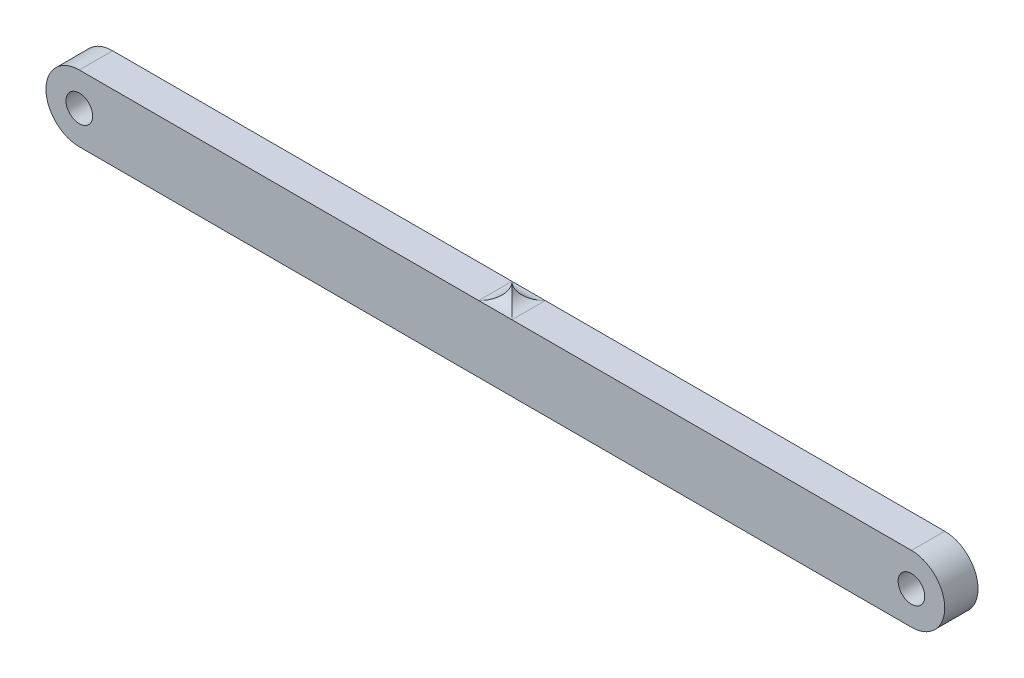
ISO-10303-21;
HEADER;
FILE_DESCRIPTION(('STEP AP214'),'2;1');
FILE_NAME('part.step','',(''),(''),'','','');
FILE_SCHEMA(('AUTOMOTIVE_DESIGN { 1 0 10303 214 1 1 1 1 }'));
ENDSEC;
DATA;
#1=APPLICATION_CONTEXT('core data for automotive mechanical design processes');
#2=APPLICATION_PROTOCOL_DEFINITION('international standard','automotive_design',2000,#1);
#3=PRODUCT_CONTEXT('',#1,'mechanical');
#4=PRODUCT('Part','Part','',(#3));
#5=PRODUCT_RELATED_PRODUCT_CATEGORY('part','',(#4));
#6=PRODUCT_DEFINITION_FORMATION('','',#4);
#7=PRODUCT_DEFINITION_CONTEXT('part definition',#1,'design');
#8=PRODUCT_DEFINITION('design','',#6,#7);
#9=PRODUCT_DEFINITION_SHAPE('','',#8);
#10=(LENGTH_UNIT() NAMED_UNIT(*) SI_UNIT(.MILLI.,.METRE.));
#11=(NAMED_UNIT(*) PLANE_ANGLE_UNIT() SI_UNIT($,.RADIAN.));
#12=(NAMED_UNIT(*) SI_UNIT($,.STERADIAN.) SOLID_ANGLE_UNIT());
#13=UNCERTAINTY_MEASURE_WITH_UNIT(LENGTH_MEASURE(1.E-05),#10,'distance_accuracy_value','');
#14=(GEOMETRIC_REPRESENTATION_CONTEXT(3) GLOBAL_UNCERTAINTY_ASSIGNED_CONTEXT((#13)) GLOBAL_UNIT_ASSIGNED_CONTEXT((#10,
#11,#12)) REPRESENTATION_CONTEXT('',''));
#15=CARTESIAN_POINT('',(0.,0.,0.));
#16=DIRECTION('',(0.,0.,1.));
#17=DIRECTION('',(1.,0.,0.));
#18=AXIS2_PLACEMENT_3D('',#15,#16,#17);
#19=CARTESIAN_POINT('',(-125.,10.,5.));
#20=DIRECTION('',(0.,-1.,0.));
#21=DIRECTION('',(1.,0.,0.));
#22=AXIS2_PLACEMENT_3D('',#19,#20,#21);
#23=PLANE('',#22);
#24=DIRECTION('',(0.,0.,1.));
#25=VECTOR('',#24,1.);
#26=CARTESIAN_POINT('',(5.,10.,-5.));
#27=LINE('',#26,#25);
#28=CARTESIAN_POINT('',(5.,10.,-5.));
#29=VERTEX_POINT('',#28);
#30=CARTESIAN_POINT('',(5.,10.,5.));
#31=VERTEX_POINT('',#30);
#32=EDGE_CURVE('E125',#29,#31,#27,.T.);
#33=ORIENTED_EDGE('',*,*,#32,.T.);
#34=DIRECTION('',(-1.,0.,0.));
#35=VECTOR('',#34,1.);
#36=CARTESIAN_POINT('',(-125.,10.,5.));
#37=LINE('',#36,#35);
#38=CARTESIAN_POINT('',(125.,10.,5.));
#39=VERTEX_POINT('',#38);
#40=EDGE_CURVE('E148',#39,#31,#37,.T.);
#41=ORIENTED_EDGE('',*,*,#40,.F.);
#42=DIRECTION('',(0.,0.,-1.));
#43=VECTOR('',#42,1.);
#44=CARTESIAN_POINT('',(125.,10.,5.));
#45=LINE('',#44,#43);
#46=CARTESIAN_POINT('',(125.,10.,-5.));
#47=VERTEX_POINT('',#46);
#48=EDGE_CURVE('E157',#39,#47,#45,.T.);
#49=ORIENTED_EDGE('',*,*,#48,.T.);
#50=DIRECTION('',(-1.,0.,0.));
#51=VECTOR('',#50,1.);
#52=CARTESIAN_POINT('',(-125.,10.,-5.));
#53=LINE('',#52,#51);
#54=EDGE_CURVE('E121',#47,#29,#53,.T.);
#55=ORIENTED_EDGE('',*,*,#54,.T.);
#56=EDGE_LOOP('',(#33,#41,#49,#55));
#57=FACE_BOUND('',#56,.T.);
#58=ADVANCED_FACE('F36',(#57),#23,.F.);
#59=CARTESIAN_POINT('',(-125.,0.,5.));
#60=DIRECTION('',(0.,0.,-1.));
#61=DIRECTION('',(-1.,0.,0.));
#62=AXIS2_PLACEMENT_3D('',#59,#60,#61);
#63=CYLINDRICAL_SURFACE('',#62,10.);
#64=CARTESIAN_POINT('',(-125.,0.,-5.));
#65=DIRECTION('',(0.,0.,1.));
#66=DIRECTION('',(1.,0.,0.));
#67=AXIS2_PLACEMENT_3D('',#64,#65,#66);
#68=CIRCLE('',#67,10.);
#69=CARTESIAN_POINT('',(-125.,10.,-5.));
#70=VERTEX_POINT('',#69);
#71=CARTESIAN_POINT('',(-125.,-10.,-5.));
#72=VERTEX_POINT('',#71);
#73=EDGE_CURVE('E120',#70,#72,#68,.T.);
#74=ORIENTED_EDGE('',*,*,#73,.T.);
#75=DIRECTION('',(0.,0.,-1.));
#76=VECTOR('',#75,1.);
#77=CARTESIAN_POINT('',(-125.,-10.,5.));
#78=LINE('',#77,#76);
#79=CARTESIAN_POINT('',(-125.,-10.,5.));
#80=VERTEX_POINT('',#79);
#81=EDGE_CURVE('E163',#80,#72,#78,.T.);
#82=ORIENTED_EDGE('',*,*,#81,.F.);
#83=CARTESIAN_POINT('',(-125.,0.,5.));
#84=DIRECTION('',(0.,0.,1.));
#85=DIRECTION('',(1.,0.,0.));
#86=AXIS2_PLACEMENT_3D('',#83,#84,#85);
#87=CIRCLE('',#86,10.);
#88=CARTESIAN_POINT('',(-125.,10.,5.));
#89=VERTEX_POINT('',#88);
#90=EDGE_CURVE('E143',#89,#80,#87,.T.);
#91=ORIENTED_EDGE('',*,*,#90,.F.);
#92=DIRECTION('',(0.,0.,-1.));
#93=VECTOR('',#92,1.);
#94=CARTESIAN_POINT('',(-125.,10.,5.));
#95=LINE('',#94,#93);
#96=EDGE_CURVE('E151',#89,#70,#95,.T.);
#97=ORIENTED_EDGE('',*,*,#96,.T.);
#98=EDGE_LOOP('',(#74,#82,#91,#97));
#99=FACE_BOUND('',#98,.T.);
#100=ADVANCED_FACE('F38',(#99),#63,.T.);
#101=CARTESIAN_POINT('',(-125.,-10.,5.));
#102=DIRECTION('',(0.,1.,0.));
#103=DIRECTION('',(-1.,0.,0.));
#104=AXIS2_PLACEMENT_3D('',#101,#102,#103);
#105=PLANE('',#104);
#106=DIRECTION('',(1.,0.,0.));
#107=VECTOR('',#106,1.);
#108=CARTESIAN_POINT('',(-125.,-10.,-5.));
#109=LINE('',#108,#107);
#110=CARTESIAN_POINT('',(125.,-9.99999999999996,-5.));
#111=VERTEX_POINT('',#110);
#112=EDGE_CURVE('E153',#72,#111,#109,.T.);
#113=ORIENTED_EDGE('',*,*,#112,.T.);
#114=DIRECTION('',(0.,0.,-1.));
#115=VECTOR('',#114,1.);
#116=CARTESIAN_POINT('',(125.,-9.99999999999996,5.));
#117=LINE('',#116,#115);
#118=CARTESIAN_POINT('',(125.,-9.99999999999996,5.));
#119=VERTEX_POINT('',#118);
#120=EDGE_CURVE('E160',#119,#111,#117,.T.);
#121=ORIENTED_EDGE('',*,*,#120,.F.);
#122=DIRECTION('',(1.,0.,0.));
#123=VECTOR('',#122,1.);
#124=CARTESIAN_POINT('',(-125.,-10.,5.));
#125=LINE('',#124,#123);
#126=EDGE_CURVE('E88',#80,#119,#125,.T.);
#127=ORIENTED_EDGE('',*,*,#126,.F.);
#128=ORIENTED_EDGE('',*,*,#81,.T.);
#129=EDGE_LOOP('',(#113,#121,#127,#128));
#130=FACE_BOUND('',#129,.T.);
#131=ADVANCED_FACE('F165',(#130),#105,.F.);
#132=CARTESIAN_POINT('',(125.,0.,5.));
#133=DIRECTION('',(0.,0.,-1.));
#134=DIRECTION('',(-1.,0.,0.));
#135=AXIS2_PLACEMENT_3D('',#132,#133,#134);
#136=CYLINDRICAL_SURFACE('',#135,10.);
#137=CARTESIAN_POINT('',(125.,0.,-5.));
#138=DIRECTION('',(0.,0.,1.));
#139=DIRECTION('',(1.,0.,0.));
#140=AXIS2_PLACEMENT_3D('',#137,#138,#139);
#141=CIRCLE('',#140,10.);
#142=EDGE_CURVE('E122',#111,#47,#141,.T.);
#143=ORIENTED_EDGE('',*,*,#142,.T.);
#144=ORIENTED_EDGE('',*,*,#48,.F.);
#145=CARTESIAN_POINT('',(125.,0.,5.));
#146=DIRECTION('',(0.,0.,1.));
#147=DIRECTION('',(1.,0.,0.));
#148=AXIS2_PLACEMENT_3D('',#145,#146,#147);
#149=CIRCLE('',#148,10.);
#150=EDGE_CURVE('E146',#119,#39,#149,.T.);
#151=ORIENTED_EDGE('',*,*,#150,.F.);
#152=ORIENTED_EDGE('',*,*,#120,.T.);
#153=EDGE_LOOP('',(#143,#144,#151,#152));
#154=FACE_BOUND('',#153,.T.);
#155=ADVANCED_FACE('F174',(#154),#136,.T.);
#156=CARTESIAN_POINT('',(-5.00000000000001,10.,5.));
#157=VERTEX_POINT('',#156);
#158=EDGE_CURVE('E58',#157,#89,#37,.T.);
#159=ORIENTED_EDGE('',*,*,#158,.F.);
#160=DIRECTION('',(0.,0.,1.));
#161=VECTOR('',#160,1.);
#162=CARTESIAN_POINT('',(-5.,10.,-5.));
#163=LINE('',#162,#161);
#164=CARTESIAN_POINT('',(-5.00000000000001,10.,-5.));
#165=VERTEX_POINT('',#164);
#166=EDGE_CURVE('E114',#165,#157,#163,.T.);
#167=ORIENTED_EDGE('',*,*,#166,.F.);
#168=EDGE_CURVE('E80',#165,#70,#53,.T.);
#169=ORIENTED_EDGE('',*,*,#168,.T.);
#170=ORIENTED_EDGE('',*,*,#96,.F.);
#171=EDGE_LOOP('',(#159,#167,#169,#170));
#172=FACE_BOUND('',#171,.T.);
#173=ADVANCED_FACE('F124',(#172),#23,.F.);
#174=CARTESIAN_POINT('',(-125.,0.,5.));
#175=DIRECTION('',(0.,0.,1.));
#176=DIRECTION('',(1.,0.,0.));
#177=AXIS2_PLACEMENT_3D('',#174,#175,#176);
#178=PLANE('',#177);
#179=DIRECTION('',(1.,0.,0.));
#180=VECTOR('',#179,1.);
#181=CARTESIAN_POINT('',(-135.,10.,5.));
#182=LINE('',#181,#180);
#183=EDGE_CURVE('E108',#157,#31,#182,.T.);
#184=ORIENTED_EDGE('',*,*,#183,.F.);
#185=ORIENTED_EDGE('',*,*,#158,.T.);
#186=ORIENTED_EDGE('',*,*,#90,.T.);
#187=ORIENTED_EDGE('',*,*,#126,.T.);
#188=ORIENTED_EDGE('',*,*,#150,.T.);
#189=ORIENTED_EDGE('',*,*,#40,.T.);
#190=EDGE_LOOP('',(#184,#185,#186,#187,#188,#189));
#191=FACE_BOUND('',#190,.T.);
#192=CARTESIAN_POINT('',(-125.,0.,5.));
#193=DIRECTION('',(0.,0.,1.));
#194=DIRECTION('',(1.,0.,0.));
#195=AXIS2_PLACEMENT_3D('',#192,#193,#194);
#196=CIRCLE('',#195,3.99999999999999);
#197=CARTESIAN_POINT('',(-121.,0.,5.));
#198=VERTEX_POINT('',#197);
#199=EDGE_CURVE('E128',#198,#198,#196,.T.);
#200=ORIENTED_EDGE('',*,*,#199,.F.);
#201=EDGE_LOOP('',(#200));
#202=FACE_BOUND('',#201,.T.);
#203=CARTESIAN_POINT('',(125.,0.,5.));
#204=DIRECTION('',(0.,0.,1.));
#205=DIRECTION('',(1.,0.,0.));
#206=AXIS2_PLACEMENT_3D('',#203,#204,#205);
#207=CIRCLE('',#206,3.99999999999998);
#208=CARTESIAN_POINT('',(129.,0.,5.));
#209=VERTEX_POINT('',#208);
#210=EDGE_CURVE('E137',#209,#209,#207,.T.);
#211=ORIENTED_EDGE('',*,*,#210,.F.);
#212=EDGE_LOOP('',(#211));
#213=FACE_BOUND('',#212,.T.);
#214=ADVANCED_FACE('F168',(#191,#202,#213),#178,.T.);
#215=CARTESIAN_POINT('',(-125.,0.,-5.));
#216=DIRECTION('',(0.,0.,1.));
#217=DIRECTION('',(1.,0.,0.));
#218=AXIS2_PLACEMENT_3D('',#215,#216,#217);
#219=PLANE('',#218);
#220=CARTESIAN_POINT('',(-125.,0.,-5.));
#221=DIRECTION('',(0.,0.,1.));
#222=DIRECTION('',(1.,0.,0.));
#223=AXIS2_PLACEMENT_3D('',#220,#221,#222);
#224=CIRCLE('',#223,4.);
#225=CARTESIAN_POINT('',(-121.,0.,-5.));
#226=VERTEX_POINT('',#225);
#227=EDGE_CURVE('E134',#226,#226,#224,.T.);
#228=ORIENTED_EDGE('',*,*,#227,.T.);
#229=EDGE_LOOP('',(#228));
#230=FACE_BOUND('',#229,.T.);
#231=CARTESIAN_POINT('',(125.,0.,-5.));
#232=DIRECTION('',(0.,0.,1.));
#233=DIRECTION('',(1.,0.,0.));
#234=AXIS2_PLACEMENT_3D('',#231,#232,#233);
#235=CIRCLE('',#234,4.);
#236=CARTESIAN_POINT('',(129.,0.,-5.));
#237=VERTEX_POINT('',#236);
#238=EDGE_CURVE('E140',#237,#237,#235,.T.);
#239=ORIENTED_EDGE('',*,*,#238,.T.);
#240=EDGE_LOOP('',(#239));
#241=FACE_BOUND('',#240,.T.);
#242=ORIENTED_EDGE('',*,*,#168,.F.);
#243=DIRECTION('',(1.,0.,0.));
#244=VECTOR('',#243,1.);
#245=CARTESIAN_POINT('',(-135.,10.,-5.));
#246=LINE('',#245,#244);
#247=EDGE_CURVE('E100',#165,#29,#246,.T.);
#248=ORIENTED_EDGE('',*,*,#247,.T.);
#249=ORIENTED_EDGE('',*,*,#54,.F.);
#250=ORIENTED_EDGE('',*,*,#142,.F.);
#251=ORIENTED_EDGE('',*,*,#112,.F.);
#252=ORIENTED_EDGE('',*,*,#73,.F.);
#253=EDGE_LOOP('',(#242,#248,#249,#250,#251,#252));
#254=FACE_BOUND('',#253,.T.);
#255=ADVANCED_FACE('F118',(#230,#241,#254),#219,.F.);
#256=CARTESIAN_POINT('',(125.,0.,5.));
#257=DIRECTION('',(0.,0.,1.));
#258=DIRECTION('',(1.,0.,0.));
#259=AXIS2_PLACEMENT_3D('',#256,#257,#258);
#260=CYLINDRICAL_SURFACE('',#259,3.99999999999999);
#261=ORIENTED_EDGE('',*,*,#238,.F.);
#262=EDGE_LOOP('',(#261));
#263=FACE_BOUND('',#262,.T.);
#264=ORIENTED_EDGE('',*,*,#210,.T.);
#265=EDGE_LOOP('',(#264));
#266=FACE_BOUND('',#265,.T.);
#267=ADVANCED_FACE('F243',(#263,#266),#260,.F.);
#268=CARTESIAN_POINT('',(-125.,0.,5.));
#269=DIRECTION('',(0.,0.,1.));
#270=DIRECTION('',(1.,0.,0.));
#271=AXIS2_PLACEMENT_3D('',#268,#269,#270);
#272=CYLINDRICAL_SURFACE('',#271,4.);
#273=ORIENTED_EDGE('',*,*,#227,.F.);
#274=EDGE_LOOP('',(#273));
#275=FACE_BOUND('',#274,.T.);
#276=ORIENTED_EDGE('',*,*,#199,.T.);
#277=EDGE_LOOP('',(#276));
#278=FACE_BOUND('',#277,.T.);
#279=ADVANCED_FACE('F189',(#275,#278),#272,.F.);
#280=CARTESIAN_POINT('',(-5.00000000000001,15.,-5.));
#281=DIRECTION('',(0.,0.,1.));
#282=DIRECTION('',(1.,0.,0.));
#283=AXIS2_PLACEMENT_3D('',#280,#281,#282);
#284=CYLINDRICAL_SURFACE('',#283,5.00000000000001);
#285=CARTESIAN_POINT('',(-5.00000000000001,15.,5.));
#286=DIRECTION('',(0.707106781186547,0.,0.707106781186547));
#287=DIRECTION('',(-0.707106781186547,0.,0.707106781186547));
#288=AXIS2_PLACEMENT_3D('',#285,#286,#287);
#289=ELLIPSE('',#288,7.07106781186549,5.00000000000001);
#290=CARTESIAN_POINT('',(0.,15.,0.));
#291=VERTEX_POINT('',#290);
#292=EDGE_CURVE('E115',#291,#157,#289,.F.);
#293=ORIENTED_EDGE('',*,*,#292,.F.);
#294=CARTESIAN_POINT('',(-5.00000000000001,15.,-5.));
#295=DIRECTION('',(-0.707106781186547,0.,0.707106781186547));
#296=DIRECTION('',(0.707106781186547,0.,0.707106781186547));
#297=AXIS2_PLACEMENT_3D('',#294,#295,#296);
#298=ELLIPSE('',#297,7.07106781186548,5.);
#299=EDGE_CURVE('E103',#165,#291,#298,.T.);
#300=ORIENTED_EDGE('',*,*,#299,.F.);
#301=ORIENTED_EDGE('',*,*,#166,.T.);
#302=EDGE_LOOP('',(#293,#300,#301));
#303=FACE_BOUND('',#302,.T.);
#304=ADVANCED_FACE('F113',(#303),#284,.F.);
#305=CARTESIAN_POINT('',(5.,15.,-5.));
#306=DIRECTION('',(0.,0.,1.));
#307=DIRECTION('',(1.,0.,0.));
#308=AXIS2_PLACEMENT_3D('',#305,#306,#307);
#309=CYLINDRICAL_SURFACE('',#308,5.);
#310=CARTESIAN_POINT('',(5.,15.,5.));
#311=DIRECTION('',(-0.707106781186547,0.,0.707106781186547));
#312=DIRECTION('',(0.707106781186547,0.,0.707106781186547));
#313=AXIS2_PLACEMENT_3D('',#310,#311,#312);
#314=ELLIPSE('',#313,7.07106781186548,5.00000000000001);
#315=EDGE_CURVE('E11',#31,#291,#314,.F.);
#316=ORIENTED_EDGE('',*,*,#315,.F.);
#317=ORIENTED_EDGE('',*,*,#32,.F.);
#318=CARTESIAN_POINT('',(5.,15.,-5.));
#319=DIRECTION('',(0.707106781186547,0.,0.707106781186547));
#320=DIRECTION('',(-0.707106781186547,0.,0.707106781186547));
#321=AXIS2_PLACEMENT_3D('',#318,#319,#320);
#322=ELLIPSE('',#321,7.07106781186548,5.);
#323=EDGE_CURVE('E44',#291,#29,#322,.T.);
#324=ORIENTED_EDGE('',*,*,#323,.F.);
#325=EDGE_LOOP('',(#316,#317,#324));
#326=FACE_BOUND('',#325,.T.);
#327=ADVANCED_FACE('F181',(#326),#309,.F.);
#328=CARTESIAN_POINT('',(-135.,15.,-5.));
#329=DIRECTION('',(1.,0.,0.));
#330=DIRECTION('',(0.,0.,-1.));
#331=AXIS2_PLACEMENT_3D('',#328,#329,#330);
#332=CYLINDRICAL_SURFACE('',#331,5.);
#333=ORIENTED_EDGE('',*,*,#299,.T.);
#334=ORIENTED_EDGE('',*,*,#323,.T.);
#335=ORIENTED_EDGE('',*,*,#247,.F.);
#336=EDGE_LOOP('',(#333,#334,#335));
#337=FACE_BOUND('',#336,.T.);
#338=ADVANCED_FACE('F102',(#337),#332,.F.);
#339=CARTESIAN_POINT('',(-135.,15.,5.));
#340=DIRECTION('',(1.,0.,0.));
#341=DIRECTION('',(0.,0.,-1.));
#342=AXIS2_PLACEMENT_3D('',#339,#340,#341);
#343=CYLINDRICAL_SURFACE('',#342,5.00000000000001);
#344=ORIENTED_EDGE('',*,*,#292,.T.);
#345=ORIENTED_EDGE('',*,*,#183,.T.);
#346=ORIENTED_EDGE('',*,*,#315,.T.);
#347=EDGE_LOOP('',(#344,#345,#346));
#348=FACE_BOUND('',#347,.T.);
#349=ADVANCED_FACE('F179',(#348),#343,.F.);
#350=CLOSED_SHELL('',(#58,#100,#131,#155,#173,#214,#255,#267,#279,#304,#327,#338,#349));
#351=MANIFOLD_SOLID_BREP('B2',#350);
#352=ADVANCED_BREP_SHAPE_REPRESENTATION('',(#18,#351),#14);
#353=SHAPE_DEFINITION_REPRESENTATION(#9,#352);
ENDSEC;
END-ISO-10303-21;
